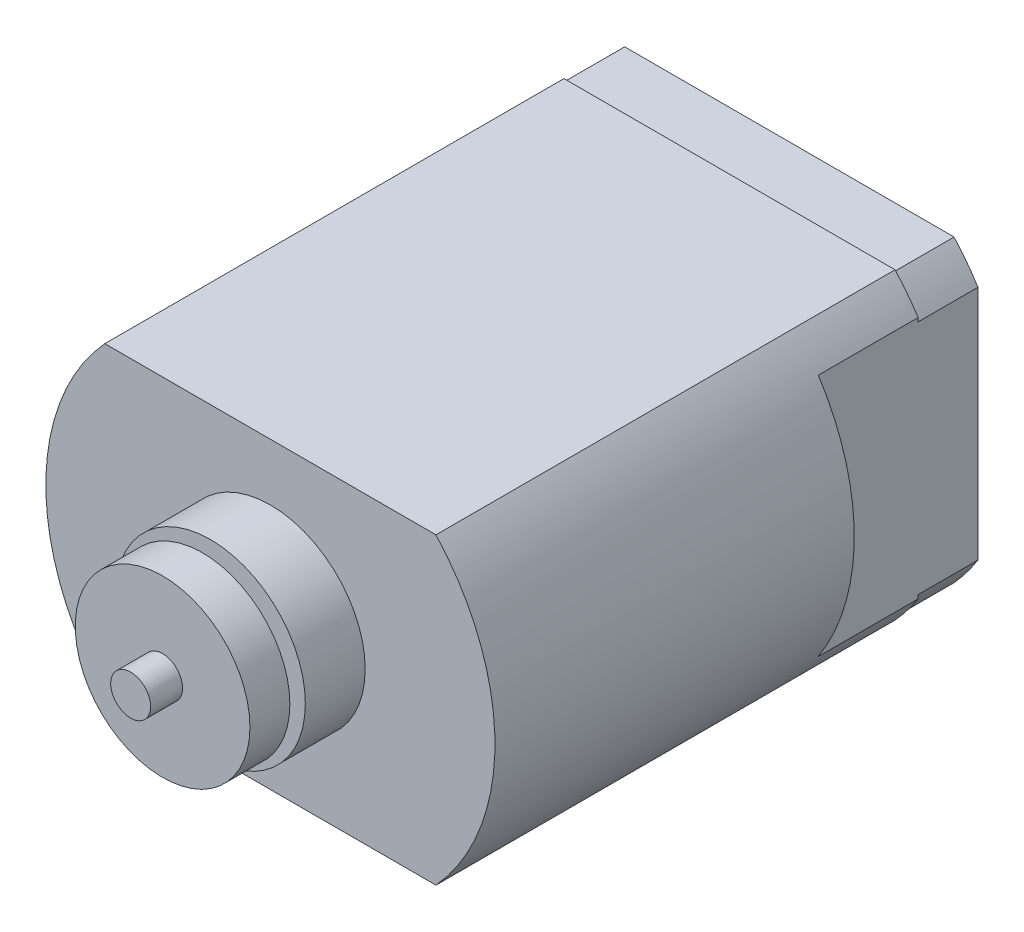
ISO-10303-21;
HEADER;
FILE_DESCRIPTION(('STEP AP214'),'2;1');
FILE_NAME('part.step','',(''),(''),'','','');
FILE_SCHEMA(('AUTOMOTIVE_DESIGN { 1 0 10303 214 1 1 1 1 }'));
ENDSEC;
DATA;
#1=APPLICATION_CONTEXT('core data for automotive mechanical design processes');
#2=APPLICATION_PROTOCOL_DEFINITION('international standard','automotive_design',2000,#1);
#3=PRODUCT_CONTEXT('',#1,'mechanical');
#4=PRODUCT('Part','Part','',(#3));
#5=PRODUCT_RELATED_PRODUCT_CATEGORY('part','',(#4));
#6=PRODUCT_DEFINITION_FORMATION('','',#4);
#7=PRODUCT_DEFINITION_CONTEXT('part definition',#1,'design');
#8=PRODUCT_DEFINITION('design','',#6,#7);
#9=PRODUCT_DEFINITION_SHAPE('','',#8);
#10=(LENGTH_UNIT() NAMED_UNIT(*) SI_UNIT(.MILLI.,.METRE.));
#11=(NAMED_UNIT(*) PLANE_ANGLE_UNIT() SI_UNIT($,.RADIAN.));
#12=(NAMED_UNIT(*) SI_UNIT($,.STERADIAN.) SOLID_ANGLE_UNIT());
#13=UNCERTAINTY_MEASURE_WITH_UNIT(LENGTH_MEASURE(1.E-05),#10,'distance_accuracy_value','');
#14=(GEOMETRIC_REPRESENTATION_CONTEXT(3) GLOBAL_UNCERTAINTY_ASSIGNED_CONTEXT((#13)) GLOBAL_UNIT_ASSIGNED_CONTEXT((#10,
#11,#12)) REPRESENTATION_CONTEXT('',''));
#15=CARTESIAN_POINT('',(0.,0.,0.));
#16=DIRECTION('',(0.,0.,1.));
#17=DIRECTION('',(1.,0.,0.));
#18=AXIS2_PLACEMENT_3D('',#15,#16,#17);
#19=CARTESIAN_POINT('',(0.,0.,3.));
#20=DIRECTION('',(0.,0.,-1.));
#21=DIRECTION('',(-1.,0.,0.));
#22=AXIS2_PLACEMENT_3D('',#19,#20,#21);
#23=CYLINDRICAL_SURFACE('',#22,11.15);
#24=DIRECTION('',(0.,0.,-1.));
#25=VECTOR('',#24,1.);
#26=CARTESIAN_POINT('',(9.45,5.9177698502054,3.));
#27=LINE('',#26,#25);
#28=CARTESIAN_POINT('',(9.45,5.9177698502054,0.));
#29=VERTEX_POINT('',#28);
#30=CARTESIAN_POINT('',(9.45,5.9177698502054,3.));
#31=VERTEX_POINT('',#30);
#32=EDGE_CURVE('E130',#29,#31,#27,.F.);
#33=ORIENTED_EDGE('',*,*,#32,.F.);
#34=CARTESIAN_POINT('',(0.,0.,0.));
#35=DIRECTION('',(0.,0.,-1.));
#36=DIRECTION('',(-1.,0.,0.));
#37=AXIS2_PLACEMENT_3D('',#34,#35,#36);
#38=CIRCLE('',#37,11.15);
#39=CARTESIAN_POINT('',(8.25060603834652,7.5,0.));
#40=VERTEX_POINT('',#39);
#41=EDGE_CURVE('E139',#40,#29,#38,.T.);
#42=ORIENTED_EDGE('',*,*,#41,.F.);
#43=DIRECTION('',(0.,0.,-1.));
#44=VECTOR('',#43,1.);
#45=CARTESIAN_POINT('',(8.25060603834652,7.5,3.));
#46=LINE('',#45,#44);
#47=CARTESIAN_POINT('',(8.25060603834652,7.5,3.));
#48=VERTEX_POINT('',#47);
#49=EDGE_CURVE('E165',#48,#40,#46,.T.);
#50=ORIENTED_EDGE('',*,*,#49,.F.);
#51=CARTESIAN_POINT('',(0.,0.,3.));
#52=DIRECTION('',(0.,0.,-1.));
#53=DIRECTION('',(-1.,0.,0.));
#54=AXIS2_PLACEMENT_3D('',#51,#52,#53);
#55=CIRCLE('',#54,11.15);
#56=EDGE_CURVE('E141',#48,#31,#55,.T.);
#57=ORIENTED_EDGE('',*,*,#56,.T.);
#58=EDGE_LOOP('',(#33,#42,#50,#57));
#59=FACE_BOUND('',#58,.T.);
#60=ADVANCED_FACE('F42',(#59),#23,.T.);
#61=CARTESIAN_POINT('',(0.,0.,26.));
#62=DIRECTION('',(0.,0.,-1.));
#63=DIRECTION('',(-1.,0.,0.));
#64=AXIS2_PLACEMENT_3D('',#61,#62,#63);
#65=CYLINDRICAL_SURFACE('',#64,11.25);
#66=CARTESIAN_POINT('',(0.,0.,3.));
#67=DIRECTION('',(0.,0.,-1.));
#68=DIRECTION('',(-1.,0.,0.));
#69=AXIS2_PLACEMENT_3D('',#66,#67,#68);
#70=CIRCLE('',#69,11.25);
#71=CARTESIAN_POINT('',(-8.29472724084403,-7.6,3.));
#72=VERTEX_POINT('',#71);
#73=CARTESIAN_POINT('',(-8.29472724084403,7.6,3.00000000000001));
#74=VERTEX_POINT('',#73);
#75=EDGE_CURVE('E65',#72,#74,#70,.T.);
#76=ORIENTED_EDGE('',*,*,#75,.F.);
#77=DIRECTION('',(0.,0.,-1.));
#78=VECTOR('',#77,1.);
#79=CARTESIAN_POINT('',(-8.29472724084403,-7.6,26.));
#80=LINE('',#79,#78);
#81=CARTESIAN_POINT('',(-8.29472724084403,-7.6,26.));
#82=VERTEX_POINT('',#81);
#83=EDGE_CURVE('E199',#82,#72,#80,.T.);
#84=ORIENTED_EDGE('',*,*,#83,.F.);
#85=CARTESIAN_POINT('',(0.,0.,26.));
#86=DIRECTION('',(0.,0.,1.));
#87=DIRECTION('',(1.,0.,0.));
#88=AXIS2_PLACEMENT_3D('',#85,#86,#87);
#89=CIRCLE('',#88,11.25);
#90=CARTESIAN_POINT('',(-8.29472724084403,7.6,26.));
#91=VERTEX_POINT('',#90);
#92=EDGE_CURVE('E196',#91,#82,#89,.T.);
#93=ORIENTED_EDGE('',*,*,#92,.F.);
#94=DIRECTION('',(0.,0.,-1.));
#95=VECTOR('',#94,1.);
#96=CARTESIAN_POINT('',(-8.29472724084403,7.6,26.));
#97=LINE('',#96,#95);
#98=EDGE_CURVE('E208',#91,#74,#97,.T.);
#99=ORIENTED_EDGE('',*,*,#98,.T.);
#100=EDGE_LOOP('',(#76,#84,#93,#99));
#101=FACE_BOUND('',#100,.T.);
#102=ADVANCED_FACE('F44',(#101),#65,.T.);
#103=CARTESIAN_POINT('',(-8.29472724084403,-7.6,26.));
#104=DIRECTION('',(0.,1.,0.));
#105=DIRECTION('',(0.,0.,1.));
#106=AXIS2_PLACEMENT_3D('',#103,#104,#105);
#107=PLANE('',#106);
#108=DIRECTION('',(-1.,0.,0.));
#109=VECTOR('',#108,1.);
#110=CARTESIAN_POINT('',(-8.29472724084403,-7.6,3.));
#111=LINE('',#110,#109);
#112=CARTESIAN_POINT('',(8.29472724084403,-7.6,3.));
#113=VERTEX_POINT('',#112);
#114=EDGE_CURVE('E173',#113,#72,#111,.T.);
#115=ORIENTED_EDGE('',*,*,#114,.F.);
#116=DIRECTION('',(0.,0.,-1.));
#117=VECTOR('',#116,1.);
#118=CARTESIAN_POINT('',(8.29472724084403,-7.6,26.));
#119=LINE('',#118,#117);
#120=CARTESIAN_POINT('',(8.29472724084403,-7.6,26.));
#121=VERTEX_POINT('',#120);
#122=EDGE_CURVE('E214',#121,#113,#119,.T.);
#123=ORIENTED_EDGE('',*,*,#122,.F.);
#124=DIRECTION('',(1.,0.,0.));
#125=VECTOR('',#124,1.);
#126=CARTESIAN_POINT('',(-8.29472724084403,-7.6,26.));
#127=LINE('',#126,#125);
#128=EDGE_CURVE('E202',#82,#121,#127,.T.);
#129=ORIENTED_EDGE('',*,*,#128,.F.);
#130=ORIENTED_EDGE('',*,*,#83,.T.);
#131=EDGE_LOOP('',(#115,#123,#129,#130));
#132=FACE_BOUND('',#131,.T.);
#133=ADVANCED_FACE('F276',(#132),#107,.F.);
#134=CARTESIAN_POINT('',(0.,0.,26.));
#135=DIRECTION('',(0.,0.,-1.));
#136=DIRECTION('',(-1.,0.,0.));
#137=AXIS2_PLACEMENT_3D('',#134,#135,#136);
#138=CYLINDRICAL_SURFACE('',#137,11.25);
#139=CARTESIAN_POINT('',(0.,0.,8.));
#140=DIRECTION('',(0.,0.,1.));
#141=DIRECTION('',(1.,0.,0.));
#142=AXIS2_PLACEMENT_3D('',#139,#140,#141);
#143=CIRCLE('',#142,11.25);
#144=CARTESIAN_POINT('',(9.45,-6.10409698481274,8.));
#145=VERTEX_POINT('',#144);
#146=CARTESIAN_POINT('',(9.45,6.10409698481274,8.));
#147=VERTEX_POINT('',#146);
#148=EDGE_CURVE('E12',#145,#147,#143,.T.);
#149=ORIENTED_EDGE('',*,*,#148,.T.);
#150=DIRECTION('',(0.,0.,-1.));
#151=VECTOR('',#150,1.);
#152=CARTESIAN_POINT('',(9.45,6.10409698481274,26.));
#153=LINE('',#152,#151);
#154=CARTESIAN_POINT('',(9.45,6.10409698481274,3.));
#155=VERTEX_POINT('',#154);
#156=EDGE_CURVE('E252',#147,#155,#153,.T.);
#157=ORIENTED_EDGE('',*,*,#156,.T.);
#158=CARTESIAN_POINT('',(0.,0.,3.));
#159=DIRECTION('',(0.,0.,-1.));
#160=DIRECTION('',(-1.,0.,0.));
#161=AXIS2_PLACEMENT_3D('',#158,#159,#160);
#162=CIRCLE('',#161,11.25);
#163=CARTESIAN_POINT('',(8.29472724084403,7.6,3.));
#164=VERTEX_POINT('',#163);
#165=EDGE_CURVE('E170',#164,#155,#162,.T.);
#166=ORIENTED_EDGE('',*,*,#165,.F.);
#167=DIRECTION('',(0.,0.,-1.));
#168=VECTOR('',#167,1.);
#169=CARTESIAN_POINT('',(8.29472724084403,7.6,26.));
#170=LINE('',#169,#168);
#171=CARTESIAN_POINT('',(8.29472724084403,7.6,26.));
#172=VERTEX_POINT('',#171);
#173=EDGE_CURVE('E211',#172,#164,#170,.T.);
#174=ORIENTED_EDGE('',*,*,#173,.F.);
#175=CARTESIAN_POINT('',(0.,0.,26.));
#176=DIRECTION('',(0.,0.,1.));
#177=DIRECTION('',(1.,0.,0.));
#178=AXIS2_PLACEMENT_3D('',#175,#176,#177);
#179=CIRCLE('',#178,11.25);
#180=EDGE_CURVE('E204',#121,#172,#179,.T.);
#181=ORIENTED_EDGE('',*,*,#180,.F.);
#182=ORIENTED_EDGE('',*,*,#122,.T.);
#183=CARTESIAN_POINT('',(9.45,-6.10409698481274,3.));
#184=VERTEX_POINT('',#183);
#185=EDGE_CURVE('E161',#184,#113,#162,.T.);
#186=ORIENTED_EDGE('',*,*,#185,.F.);
#187=DIRECTION('',(0.,0.,-1.));
#188=VECTOR('',#187,1.);
#189=CARTESIAN_POINT('',(9.45,-6.10409698481274,26.));
#190=LINE('',#189,#188);
#191=EDGE_CURVE('E143',#184,#145,#190,.F.);
#192=ORIENTED_EDGE('',*,*,#191,.T.);
#193=EDGE_LOOP('',(#149,#157,#166,#174,#181,#182,#186,#192));
#194=FACE_BOUND('',#193,.T.);
#195=ADVANCED_FACE('F269',(#194),#138,.T.);
#196=CARTESIAN_POINT('',(-8.29472724084403,7.6,26.));
#197=DIRECTION('',(0.,-1.,0.));
#198=DIRECTION('',(0.,0.,-1.));
#199=AXIS2_PLACEMENT_3D('',#196,#197,#198);
#200=PLANE('',#199);
#201=DIRECTION('',(1.,0.,0.));
#202=VECTOR('',#201,1.);
#203=CARTESIAN_POINT('',(8.29472724084403,7.6,3.));
#204=LINE('',#203,#202);
#205=EDGE_CURVE('E176',#74,#164,#204,.T.);
#206=ORIENTED_EDGE('',*,*,#205,.F.);
#207=ORIENTED_EDGE('',*,*,#98,.F.);
#208=DIRECTION('',(-1.,0.,0.));
#209=VECTOR('',#208,1.);
#210=CARTESIAN_POINT('',(-8.29472724084403,7.6,26.));
#211=LINE('',#210,#209);
#212=EDGE_CURVE('E206',#172,#91,#211,.T.);
#213=ORIENTED_EDGE('',*,*,#212,.F.);
#214=ORIENTED_EDGE('',*,*,#173,.T.);
#215=EDGE_LOOP('',(#206,#207,#213,#214));
#216=FACE_BOUND('',#215,.T.);
#217=ADVANCED_FACE('F283',(#216),#200,.F.);
#218=CARTESIAN_POINT('',(0.,0.,33.));
#219=DIRECTION('',(0.,0.,-1.));
#220=DIRECTION('',(-1.,0.,0.));
#221=AXIS2_PLACEMENT_3D('',#218,#219,#220);
#222=CYLINDRICAL_SURFACE('',#221,1.);
#223=CARTESIAN_POINT('',(0.,0.,29.));
#224=DIRECTION('',(0.,0.,1.));
#225=DIRECTION('',(1.,0.,0.));
#226=AXIS2_PLACEMENT_3D('',#223,#224,#225);
#227=CIRCLE('',#226,1.);
#228=CARTESIAN_POINT('',(1.,0.,29.));
#229=VERTEX_POINT('',#228);
#230=EDGE_CURVE('E189',#229,#229,#227,.T.);
#231=ORIENTED_EDGE('',*,*,#230,.T.);
#232=EDGE_LOOP('',(#231));
#233=FACE_BOUND('',#232,.T.);
#234=CARTESIAN_POINT('',(0.,0.,29.4));
#235=DIRECTION('',(0.,0.,1.));
#236=DIRECTION('',(1.,0.,0.));
#237=AXIS2_PLACEMENT_3D('',#234,#235,#236);
#238=CIRCLE('',#237,1.);
#239=CARTESIAN_POINT('',(1.,0.,29.4));
#240=VERTEX_POINT('',#239);
#241=EDGE_CURVE('E192',#240,#240,#238,.T.);
#242=ORIENTED_EDGE('',*,*,#241,.F.);
#243=EDGE_LOOP('',(#242));
#244=FACE_BOUND('',#243,.T.);
#245=ADVANCED_FACE('F290',(#233,#244),#222,.T.);
#246=CARTESIAN_POINT('',(0.,0.,26.));
#247=DIRECTION('',(0.,0.,1.));
#248=DIRECTION('',(1.,0.,0.));
#249=AXIS2_PLACEMENT_3D('',#246,#247,#248);
#250=PLANE('',#249);
#251=CARTESIAN_POINT('',(0.,0.,26.));
#252=DIRECTION('',(0.,0.,1.));
#253=DIRECTION('',(1.,0.,0.));
#254=AXIS2_PLACEMENT_3D('',#251,#252,#253);
#255=CIRCLE('',#254,4.75);
#256=CARTESIAN_POINT('',(4.75,0.,26.));
#257=VERTEX_POINT('',#256);
#258=EDGE_CURVE('E193',#257,#257,#255,.T.);
#259=ORIENTED_EDGE('',*,*,#258,.F.);
#260=EDGE_LOOP('',(#259));
#261=FACE_BOUND('',#260,.T.);
#262=ORIENTED_EDGE('',*,*,#92,.T.);
#263=ORIENTED_EDGE('',*,*,#128,.T.);
#264=ORIENTED_EDGE('',*,*,#180,.T.);
#265=ORIENTED_EDGE('',*,*,#212,.T.);
#266=EDGE_LOOP('',(#262,#263,#264,#265));
#267=FACE_BOUND('',#266,.T.);
#268=ADVANCED_FACE('F287',(#261,#267),#250,.T.);
#269=CARTESIAN_POINT('',(0.,0.,29.));
#270=DIRECTION('',(0.,0.,-1.));
#271=DIRECTION('',(-1.,0.,0.));
#272=AXIS2_PLACEMENT_3D('',#269,#270,#271);
#273=CYLINDRICAL_SURFACE('',#272,4.75);
#274=CARTESIAN_POINT('',(0.,0.,29.));
#275=DIRECTION('',(0.,0.,1.));
#276=DIRECTION('',(1.,0.,0.));
#277=AXIS2_PLACEMENT_3D('',#274,#275,#276);
#278=CIRCLE('',#277,4.75);
#279=CARTESIAN_POINT('',(4.75,0.,29.));
#280=VERTEX_POINT('',#279);
#281=EDGE_CURVE('E188',#280,#280,#278,.T.);
#282=ORIENTED_EDGE('',*,*,#281,.F.);
#283=EDGE_LOOP('',(#282));
#284=FACE_BOUND('',#283,.T.);
#285=ORIENTED_EDGE('',*,*,#258,.T.);
#286=EDGE_LOOP('',(#285));
#287=FACE_BOUND('',#286,.T.);
#288=ADVANCED_FACE('F289',(#284,#287),#273,.T.);
#289=CARTESIAN_POINT('',(0.,0.,29.));
#290=DIRECTION('',(0.,0.,1.));
#291=DIRECTION('',(1.,0.,0.));
#292=AXIS2_PLACEMENT_3D('',#289,#290,#291);
#293=PLANE('',#292);
#294=ORIENTED_EDGE('',*,*,#230,.F.);
#295=EDGE_LOOP('',(#294));
#296=FACE_BOUND('',#295,.T.);
#297=ORIENTED_EDGE('',*,*,#281,.T.);
#298=EDGE_LOOP('',(#297));
#299=FACE_BOUND('',#298,.T.);
#300=ADVANCED_FACE('F297',(#296,#299),#293,.T.);
#301=CARTESIAN_POINT('',(0.,0.,29.4));
#302=DIRECTION('',(0.,0.,1.));
#303=DIRECTION('',(1.,0.,0.));
#304=AXIS2_PLACEMENT_3D('',#301,#302,#303);
#305=CYLINDRICAL_SURFACE('',#304,4.375);
#306=CARTESIAN_POINT('',(0.,0.,29.4));
#307=DIRECTION('',(0.,0.,1.));
#308=DIRECTION('',(1.,0.,0.));
#309=AXIS2_PLACEMENT_3D('',#306,#307,#308);
#310=CIRCLE('',#309,4.375);
#311=CARTESIAN_POINT('',(4.375,0.,29.4));
#312=VERTEX_POINT('',#311);
#313=EDGE_CURVE('E179',#312,#312,#310,.T.);
#314=ORIENTED_EDGE('',*,*,#313,.T.);
#315=EDGE_LOOP('',(#314));
#316=FACE_BOUND('',#315,.T.);
#317=CARTESIAN_POINT('',(0.,0.,31.4));
#318=DIRECTION('',(0.,0.,1.));
#319=DIRECTION('',(1.,0.,0.));
#320=AXIS2_PLACEMENT_3D('',#317,#318,#319);
#321=CIRCLE('',#320,4.375);
#322=CARTESIAN_POINT('',(4.375,0.,31.4));
#323=VERTEX_POINT('',#322);
#324=EDGE_CURVE('E178',#323,#323,#321,.T.);
#325=ORIENTED_EDGE('',*,*,#324,.F.);
#326=EDGE_LOOP('',(#325));
#327=FACE_BOUND('',#326,.T.);
#328=ADVANCED_FACE('F341',(#316,#327),#305,.T.);
#329=CARTESIAN_POINT('',(0.,0.,29.4));
#330=DIRECTION('',(0.,0.,1.));
#331=DIRECTION('',(1.,0.,0.));
#332=AXIS2_PLACEMENT_3D('',#329,#330,#331);
#333=PLANE('',#332);
#334=ORIENTED_EDGE('',*,*,#241,.T.);
#335=EDGE_LOOP('',(#334));
#336=FACE_BOUND('',#335,.T.);
#337=ORIENTED_EDGE('',*,*,#313,.F.);
#338=EDGE_LOOP('',(#337));
#339=FACE_BOUND('',#338,.T.);
#340=ADVANCED_FACE('F337',(#336,#339),#333,.F.);
#341=CARTESIAN_POINT('',(0.,0.,31.4));
#342=DIRECTION('',(0.,0.,1.));
#343=DIRECTION('',(1.,0.,0.));
#344=AXIS2_PLACEMENT_3D('',#341,#342,#343);
#345=PLANE('',#344);
#346=CARTESIAN_POINT('',(0.,0.,31.4));
#347=DIRECTION('',(0.,0.,1.));
#348=DIRECTION('',(1.,0.,0.));
#349=AXIS2_PLACEMENT_3D('',#346,#347,#348);
#350=CIRCLE('',#349,1.);
#351=CARTESIAN_POINT('',(1.,0.,31.4));
#352=VERTEX_POINT('',#351);
#353=EDGE_CURVE('E182',#352,#352,#350,.T.);
#354=ORIENTED_EDGE('',*,*,#353,.F.);
#355=EDGE_LOOP('',(#354));
#356=FACE_BOUND('',#355,.T.);
#357=ORIENTED_EDGE('',*,*,#324,.T.);
#358=EDGE_LOOP('',(#357));
#359=FACE_BOUND('',#358,.T.);
#360=ADVANCED_FACE('F340',(#356,#359),#345,.T.);
#361=CARTESIAN_POINT('',(0.,0.,33.));
#362=DIRECTION('',(0.,0.,1.));
#363=DIRECTION('',(1.,0.,0.));
#364=AXIS2_PLACEMENT_3D('',#361,#362,#363);
#365=PLANE('',#364);
#366=CARTESIAN_POINT('',(0.,0.,33.));
#367=DIRECTION('',(0.,0.,1.));
#368=DIRECTION('',(1.,0.,0.));
#369=AXIS2_PLACEMENT_3D('',#366,#367,#368);
#370=CIRCLE('',#369,1.);
#371=CARTESIAN_POINT('',(1.,0.,33.));
#372=VERTEX_POINT('',#371);
#373=EDGE_CURVE('E185',#372,#372,#370,.T.);
#374=ORIENTED_EDGE('',*,*,#373,.T.);
#375=EDGE_LOOP('',(#374));
#376=FACE_BOUND('',#375,.T.);
#377=ADVANCED_FACE('F344',(#376),#365,.T.);
#378=ORIENTED_EDGE('',*,*,#353,.T.);
#379=EDGE_LOOP('',(#378));
#380=FACE_BOUND('',#379,.T.);
#381=ORIENTED_EDGE('',*,*,#373,.F.);
#382=EDGE_LOOP('',(#381));
#383=FACE_BOUND('',#382,.T.);
#384=ADVANCED_FACE('F302',(#380,#383),#222,.T.);
#385=CARTESIAN_POINT('',(0.,0.,3.));
#386=DIRECTION('',(0.,0.,-1.));
#387=DIRECTION('',(-1.,0.,0.));
#388=AXIS2_PLACEMENT_3D('',#385,#386,#387);
#389=PLANE('',#388);
#390=DIRECTION('',(0.,1.,0.));
#391=VECTOR('',#390,1.);
#392=CARTESIAN_POINT('',(9.45,0.,3.));
#393=LINE('',#392,#391);
#394=CARTESIAN_POINT('',(9.45,-5.9177698502054,3.));
#395=VERTEX_POINT('',#394);
#396=EDGE_CURVE('E258',#184,#395,#393,.T.);
#397=ORIENTED_EDGE('',*,*,#396,.F.);
#398=ORIENTED_EDGE('',*,*,#185,.T.);
#399=ORIENTED_EDGE('',*,*,#114,.T.);
#400=ORIENTED_EDGE('',*,*,#75,.T.);
#401=ORIENTED_EDGE('',*,*,#205,.T.);
#402=ORIENTED_EDGE('',*,*,#165,.T.);
#403=EDGE_CURVE('E142',#31,#155,#393,.T.);
#404=ORIENTED_EDGE('',*,*,#403,.F.);
#405=ORIENTED_EDGE('',*,*,#56,.F.);
#406=DIRECTION('',(1.,0.,0.));
#407=VECTOR('',#406,1.);
#408=CARTESIAN_POINT('',(-8.25060603834652,7.5,3.));
#409=LINE('',#408,#407);
#410=CARTESIAN_POINT('',(-8.25060603834652,7.5,3.));
#411=VERTEX_POINT('',#410);
#412=EDGE_CURVE('E234',#411,#48,#409,.T.);
#413=ORIENTED_EDGE('',*,*,#412,.F.);
#414=CARTESIAN_POINT('',(0.,0.,3.));
#415=DIRECTION('',(0.,0.,-1.));
#416=DIRECTION('',(-1.,0.,0.));
#417=AXIS2_PLACEMENT_3D('',#414,#415,#416);
#418=CIRCLE('',#417,11.15);
#419=CARTESIAN_POINT('',(-8.25060603834652,-7.5,3.));
#420=VERTEX_POINT('',#419);
#421=EDGE_CURVE('E154',#420,#411,#418,.T.);
#422=ORIENTED_EDGE('',*,*,#421,.F.);
#423=DIRECTION('',(-1.,0.,0.));
#424=VECTOR('',#423,1.);
#425=CARTESIAN_POINT('',(8.25060603834652,-7.5,3.));
#426=LINE('',#425,#424);
#427=CARTESIAN_POINT('',(8.25060603834652,-7.5,3.));
#428=VERTEX_POINT('',#427);
#429=EDGE_CURVE('E169',#428,#420,#426,.T.);
#430=ORIENTED_EDGE('',*,*,#429,.F.);
#431=EDGE_CURVE('E237',#395,#428,#55,.T.);
#432=ORIENTED_EDGE('',*,*,#431,.F.);
#433=EDGE_LOOP('',(#397,#398,#399,#400,#401,#402,#404,#405,#413,#422,#430,#432));
#434=FACE_BOUND('',#433,.T.);
#435=ADVANCED_FACE('F273',(#434),#389,.T.);
#436=CARTESIAN_POINT('',(0.,0.,3.));
#437=DIRECTION('',(0.,0.,-1.));
#438=DIRECTION('',(-1.,0.,0.));
#439=AXIS2_PLACEMENT_3D('',#436,#437,#438);
#440=CYLINDRICAL_SURFACE('',#439,11.15);
#441=CARTESIAN_POINT('',(0.,0.,0.));
#442=DIRECTION('',(0.,0.,-1.));
#443=DIRECTION('',(-1.,0.,0.));
#444=AXIS2_PLACEMENT_3D('',#441,#442,#443);
#445=CIRCLE('',#444,11.15);
#446=CARTESIAN_POINT('',(-8.25060603834652,-7.5,0.));
#447=VERTEX_POINT('',#446);
#448=CARTESIAN_POINT('',(-8.25060603834652,7.5,0.));
#449=VERTEX_POINT('',#448);
#450=EDGE_CURVE('E240',#447,#449,#445,.T.);
#451=ORIENTED_EDGE('',*,*,#450,.F.);
#452=DIRECTION('',(0.,0.,-1.));
#453=VECTOR('',#452,1.);
#454=CARTESIAN_POINT('',(-8.25060603834652,-7.5,3.));
#455=LINE('',#454,#453);
#456=EDGE_CURVE('E159',#420,#447,#455,.T.);
#457=ORIENTED_EDGE('',*,*,#456,.F.);
#458=ORIENTED_EDGE('',*,*,#421,.T.);
#459=DIRECTION('',(0.,0.,-1.));
#460=VECTOR('',#459,1.);
#461=CARTESIAN_POINT('',(-8.25060603834652,7.5,3.));
#462=LINE('',#461,#460);
#463=EDGE_CURVE('E167',#411,#449,#462,.T.);
#464=ORIENTED_EDGE('',*,*,#463,.T.);
#465=EDGE_LOOP('',(#451,#457,#458,#464));
#466=FACE_BOUND('',#465,.T.);
#467=ADVANCED_FACE('F322',(#466),#440,.T.);
#468=CARTESIAN_POINT('',(8.25060603834652,-7.5,3.));
#469=DIRECTION('',(0.,-1.,0.));
#470=DIRECTION('',(1.,0.,0.));
#471=AXIS2_PLACEMENT_3D('',#468,#469,#470);
#472=PLANE('',#471);
#473=DIRECTION('',(-1.,0.,0.));
#474=VECTOR('',#473,1.);
#475=CARTESIAN_POINT('',(8.25060603834652,-7.5,0.));
#476=LINE('',#475,#474);
#477=CARTESIAN_POINT('',(8.25060603834652,-7.5,0.));
#478=VERTEX_POINT('',#477);
#479=EDGE_CURVE('E150',#478,#447,#476,.T.);
#480=ORIENTED_EDGE('',*,*,#479,.F.);
#481=DIRECTION('',(0.,0.,-1.));
#482=VECTOR('',#481,1.);
#483=CARTESIAN_POINT('',(8.25060603834652,-7.5,3.));
#484=LINE('',#483,#482);
#485=EDGE_CURVE('E162',#428,#478,#484,.T.);
#486=ORIENTED_EDGE('',*,*,#485,.F.);
#487=ORIENTED_EDGE('',*,*,#429,.T.);
#488=ORIENTED_EDGE('',*,*,#456,.T.);
#489=EDGE_LOOP('',(#480,#486,#487,#488));
#490=FACE_BOUND('',#489,.T.);
#491=ADVANCED_FACE('F315',(#490),#472,.T.);
#492=DIRECTION('',(0.,0.,-1.));
#493=VECTOR('',#492,1.);
#494=CARTESIAN_POINT('',(9.45,-5.9177698502054,3.));
#495=LINE('',#494,#493);
#496=CARTESIAN_POINT('',(9.45,-5.9177698502054,0.));
#497=VERTEX_POINT('',#496);
#498=EDGE_CURVE('E57',#395,#497,#495,.T.);
#499=ORIENTED_EDGE('',*,*,#498,.F.);
#500=ORIENTED_EDGE('',*,*,#431,.T.);
#501=ORIENTED_EDGE('',*,*,#485,.T.);
#502=EDGE_CURVE('E151',#497,#478,#38,.T.);
#503=ORIENTED_EDGE('',*,*,#502,.F.);
#504=EDGE_LOOP('',(#499,#500,#501,#503));
#505=FACE_BOUND('',#504,.T.);
#506=ADVANCED_FACE('F307',(#505),#23,.T.);
#507=CARTESIAN_POINT('',(-8.25060603834652,7.5,3.));
#508=DIRECTION('',(0.,1.,0.));
#509=DIRECTION('',(0.,0.,1.));
#510=AXIS2_PLACEMENT_3D('',#507,#508,#509);
#511=PLANE('',#510);
#512=DIRECTION('',(1.,0.,0.));
#513=VECTOR('',#512,1.);
#514=CARTESIAN_POINT('',(-8.25060603834652,7.5,0.));
#515=LINE('',#514,#513);
#516=EDGE_CURVE('E149',#449,#40,#515,.T.);
#517=ORIENTED_EDGE('',*,*,#516,.F.);
#518=ORIENTED_EDGE('',*,*,#463,.F.);
#519=ORIENTED_EDGE('',*,*,#412,.T.);
#520=ORIENTED_EDGE('',*,*,#49,.T.);
#521=EDGE_LOOP('',(#517,#518,#519,#520));
#522=FACE_BOUND('',#521,.T.);
#523=ADVANCED_FACE('F314',(#522),#511,.T.);
#524=CARTESIAN_POINT('',(0.,0.,0.));
#525=DIRECTION('',(0.,0.,1.));
#526=DIRECTION('',(1.,0.,0.));
#527=AXIS2_PLACEMENT_3D('',#524,#525,#526);
#528=PLANE('',#527);
#529=CARTESIAN_POINT('',(0.,0.,0.));
#530=DIRECTION('',(0.,0.,-1.));
#531=DIRECTION('',(-1.,0.,0.));
#532=AXIS2_PLACEMENT_3D('',#529,#530,#531);
#533=CIRCLE('',#532,3.135);
#534=CARTESIAN_POINT('',(-3.135,0.,0.));
#535=VERTEX_POINT('',#534);
#536=EDGE_CURVE('E135',#535,#535,#533,.T.);
#537=ORIENTED_EDGE('',*,*,#536,.F.);
#538=EDGE_LOOP('',(#537));
#539=FACE_BOUND('',#538,.T.);
#540=ORIENTED_EDGE('',*,*,#41,.T.);
#541=DIRECTION('',(0.,-1.,0.));
#542=VECTOR('',#541,1.);
#543=CARTESIAN_POINT('',(9.45,0.,0.));
#544=LINE('',#543,#542);
#545=EDGE_CURVE('E50',#29,#497,#544,.T.);
#546=ORIENTED_EDGE('',*,*,#545,.T.);
#547=ORIENTED_EDGE('',*,*,#502,.T.);
#548=ORIENTED_EDGE('',*,*,#479,.T.);
#549=ORIENTED_EDGE('',*,*,#450,.T.);
#550=ORIENTED_EDGE('',*,*,#516,.T.);
#551=EDGE_LOOP('',(#540,#546,#547,#548,#549,#550));
#552=FACE_BOUND('',#551,.T.);
#553=ADVANCED_FACE('F146',(#539,#552),#528,.F.);
#554=CARTESIAN_POINT('',(0.,0.,-2.5));
#555=DIRECTION('',(0.,0.,1.));
#556=DIRECTION('',(1.,0.,0.));
#557=AXIS2_PLACEMENT_3D('',#554,#555,#556);
#558=CYLINDRICAL_SURFACE('',#557,3.135);
#559=CARTESIAN_POINT('',(0.,0.,-2.5));
#560=DIRECTION('',(0.,0.,-1.));
#561=DIRECTION('',(-1.,0.,0.));
#562=AXIS2_PLACEMENT_3D('',#559,#560,#561);
#563=CIRCLE('',#562,3.135);
#564=CARTESIAN_POINT('',(-3.135,0.,-2.5));
#565=VERTEX_POINT('',#564);
#566=EDGE_CURVE('E230',#565,#565,#563,.T.);
#567=ORIENTED_EDGE('',*,*,#566,.F.);
#568=EDGE_LOOP('',(#567));
#569=FACE_BOUND('',#568,.T.);
#570=ORIENTED_EDGE('',*,*,#536,.T.);
#571=EDGE_LOOP('',(#570));
#572=FACE_BOUND('',#571,.T.);
#573=ADVANCED_FACE('F415',(#569,#572),#558,.T.);
#574=CARTESIAN_POINT('',(0.,0.,-2.5));
#575=DIRECTION('',(0.,0.,-1.));
#576=DIRECTION('',(-1.,0.,0.));
#577=AXIS2_PLACEMENT_3D('',#574,#575,#576);
#578=PLANE('',#577);
#579=CARTESIAN_POINT('',(0.,0.,-2.5));
#580=DIRECTION('',(0.,0.,-1.));
#581=DIRECTION('',(-1.,0.,0.));
#582=AXIS2_PLACEMENT_3D('',#579,#580,#581);
#583=CIRCLE('',#582,1.25);
#584=CARTESIAN_POINT('',(-1.25,0.,-2.5));
#585=VERTEX_POINT('',#584);
#586=EDGE_CURVE('E247',#585,#585,#583,.T.);
#587=ORIENTED_EDGE('',*,*,#586,.F.);
#588=EDGE_LOOP('',(#587));
#589=FACE_BOUND('',#588,.T.);
#590=ORIENTED_EDGE('',*,*,#566,.T.);
#591=EDGE_LOOP('',(#590));
#592=FACE_BOUND('',#591,.T.);
#593=ADVANCED_FACE('F462',(#589,#592),#578,.T.);
#594=CARTESIAN_POINT('',(0.,0.,-1.5));
#595=DIRECTION('',(0.,0.,-1.));
#596=DIRECTION('',(-1.,0.,0.));
#597=AXIS2_PLACEMENT_3D('',#594,#595,#596);
#598=CYLINDRICAL_SURFACE('',#597,1.25);
#599=CARTESIAN_POINT('',(0.,0.,-1.5));
#600=DIRECTION('',(0.,0.,-1.));
#601=DIRECTION('',(-1.,0.,0.));
#602=AXIS2_PLACEMENT_3D('',#599,#600,#601);
#603=CIRCLE('',#602,1.25);
#604=CARTESIAN_POINT('',(-1.25,0.,-1.5));
#605=VERTEX_POINT('',#604);
#606=EDGE_CURVE('E243',#605,#605,#603,.T.);
#607=ORIENTED_EDGE('',*,*,#606,.F.);
#608=EDGE_LOOP('',(#607));
#609=FACE_BOUND('',#608,.T.);
#610=ORIENTED_EDGE('',*,*,#586,.T.);
#611=EDGE_LOOP('',(#610));
#612=FACE_BOUND('',#611,.T.);
#613=ADVANCED_FACE('F454',(#609,#612),#598,.F.);
#614=CARTESIAN_POINT('',(0.,0.,-1.5));
#615=DIRECTION('',(0.,0.,-1.));
#616=DIRECTION('',(-1.,0.,0.));
#617=AXIS2_PLACEMENT_3D('',#614,#615,#616);
#618=PLANE('',#617);
#619=ORIENTED_EDGE('',*,*,#606,.T.);
#620=EDGE_LOOP('',(#619));
#621=FACE_BOUND('',#620,.T.);
#622=ADVANCED_FACE('F426',(#621),#618,.T.);
#623=CARTESIAN_POINT('',(0.,0.,8.));
#624=DIRECTION('',(0.,0.,1.));
#625=DIRECTION('',(1.,0.,0.));
#626=AXIS2_PLACEMENT_3D('',#623,#624,#625);
#627=PLANE('',#626);
#628=ORIENTED_EDGE('',*,*,#148,.F.);
#629=DIRECTION('',(0.,1.,0.));
#630=VECTOR('',#629,1.);
#631=CARTESIAN_POINT('',(9.45,7.6,8.));
#632=LINE('',#631,#630);
#633=EDGE_CURVE('E261',#145,#147,#632,.T.);
#634=ORIENTED_EDGE('',*,*,#633,.T.);
#635=EDGE_LOOP('',(#628,#634));
#636=FACE_BOUND('',#635,.T.);
#637=ADVANCED_FACE('F264',(#636),#627,.F.);
#638=CARTESIAN_POINT('',(9.45,7.6,8.));
#639=DIRECTION('',(-1.,0.,0.));
#640=DIRECTION('',(0.,-1.,0.));
#641=AXIS2_PLACEMENT_3D('',#638,#639,#640);
#642=PLANE('',#641);
#643=ORIENTED_EDGE('',*,*,#633,.F.);
#644=ORIENTED_EDGE('',*,*,#191,.F.);
#645=ORIENTED_EDGE('',*,*,#396,.T.);
#646=ORIENTED_EDGE('',*,*,#498,.T.);
#647=ORIENTED_EDGE('',*,*,#545,.F.);
#648=ORIENTED_EDGE('',*,*,#32,.T.);
#649=ORIENTED_EDGE('',*,*,#403,.T.);
#650=ORIENTED_EDGE('',*,*,#156,.F.);
#651=EDGE_LOOP('',(#643,#644,#645,#646,#647,#648,#649,#650));
#652=FACE_BOUND('',#651,.T.);
#653=ADVANCED_FACE('F129',(#652),#642,.F.);
#654=CLOSED_SHELL('',(#60,#102,#133,#195,#217,#245,#268,#288,#300,#328,#340,#360,#377,#384,#435,
#467,#491,#506,#523,#553,#573,#593,#613,#622,#637,#653));
#655=MANIFOLD_SOLID_BREP('B2',#654);
#656=ADVANCED_BREP_SHAPE_REPRESENTATION('',(#18,#655),#14);
#657=SHAPE_DEFINITION_REPRESENTATION(#9,#656);
ENDSEC;
END-ISO-10303-21;
